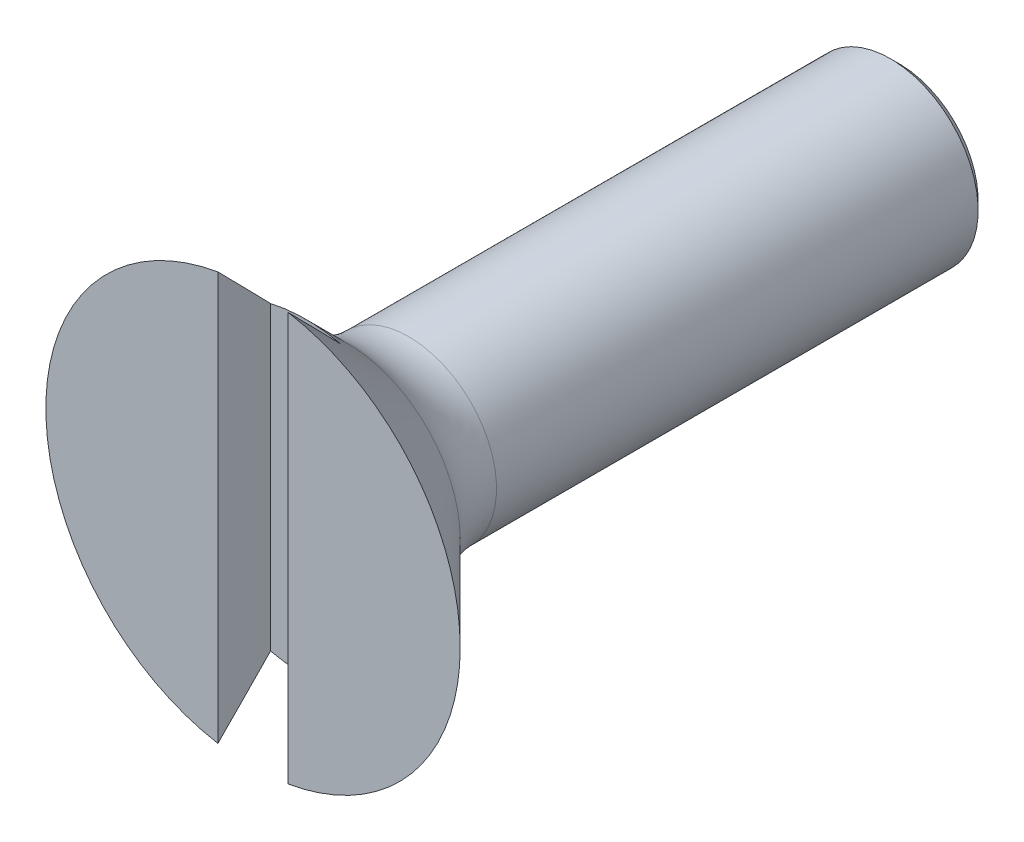
ISO-10303-21;
HEADER;
FILE_DESCRIPTION(('STEP AP214'),'2;1');
FILE_NAME('part.step','',(''),(''),'','','');
FILE_SCHEMA(('AUTOMOTIVE_DESIGN { 1 0 10303 214 1 1 1 1 }'));
ENDSEC;
DATA;
#1=APPLICATION_CONTEXT('core data for automotive mechanical design processes');
#2=APPLICATION_PROTOCOL_DEFINITION('international standard','automotive_design',2000,#1);
#3=PRODUCT_CONTEXT('',#1,'mechanical');
#4=PRODUCT('Part','Part','',(#3));
#5=PRODUCT_RELATED_PRODUCT_CATEGORY('part','',(#4));
#6=PRODUCT_DEFINITION_FORMATION('','',#4);
#7=PRODUCT_DEFINITION_CONTEXT('part definition',#1,'design');
#8=PRODUCT_DEFINITION('design','',#6,#7);
#9=PRODUCT_DEFINITION_SHAPE('','',#8);
#10=(LENGTH_UNIT() NAMED_UNIT(*) SI_UNIT(.MILLI.,.METRE.));
#11=(NAMED_UNIT(*) PLANE_ANGLE_UNIT() SI_UNIT($,.RADIAN.));
#12=(NAMED_UNIT(*) SI_UNIT($,.STERADIAN.) SOLID_ANGLE_UNIT());
#13=UNCERTAINTY_MEASURE_WITH_UNIT(LENGTH_MEASURE(1.E-05),#10,'distance_accuracy_value','');
#14=(GEOMETRIC_REPRESENTATION_CONTEXT(3) GLOBAL_UNCERTAINTY_ASSIGNED_CONTEXT((#13)) GLOBAL_UNIT_ASSIGNED_CONTEXT((#10,
#11,#12)) REPRESENTATION_CONTEXT('',''));
#15=CARTESIAN_POINT('',(0.,0.,0.));
#16=DIRECTION('',(0.,0.,1.));
#17=DIRECTION('',(1.,0.,0.));
#18=AXIS2_PLACEMENT_3D('',#15,#16,#17);
#19=CARTESIAN_POINT('',(0.,0.,-7.36000000000002));
#20=DIRECTION('',(0.,0.,-1.));
#21=DIRECTION('',(-1.,0.,0.));
#22=AXIS2_PLACEMENT_3D('',#19,#20,#21);
#23=PLANE('',#22);
#24=CARTESIAN_POINT('',(0.,0.,-7.36000000000002));
#25=DIRECTION('',(0.,0.,-1.));
#26=DIRECTION('',(-1.,0.,0.));
#27=AXIS2_PLACEMENT_3D('',#24,#25,#26);
#28=CIRCLE('',#27,0.900000000000001);
#29=CARTESIAN_POINT('',(-0.900000000000001,0.,-7.36000000000002));
#30=VERTEX_POINT('',#29);
#31=EDGE_CURVE('E294',#30,#30,#28,.T.);
#32=ORIENTED_EDGE('',*,*,#31,.T.);
#33=EDGE_LOOP('',(#32));
#34=FACE_BOUND('',#33,.T.);
#35=ADVANCED_FACE('F53',(#34),#23,.T.);
#36=CARTESIAN_POINT('',(0.,0.,-7.36000000000002));
#37=DIRECTION('',(0.,0.,1.));
#38=DIRECTION('',(1.,0.,0.));
#39=AXIS2_PLACEMENT_3D('',#36,#37,#38);
#40=CYLINDRICAL_SURFACE('',#39,1.);
#41=CARTESIAN_POINT('',(0.,0.,-1.7742135623731));
#42=DIRECTION('',(0.,0.,-1.));
#43=DIRECTION('',(-1.,0.,0.));
#44=AXIS2_PLACEMENT_3D('',#41,#42,#43);
#45=CIRCLE('',#44,1.);
#46=CARTESIAN_POINT('',(-1.,0.,-1.7742135623731));
#47=VERTEX_POINT('',#46);
#48=EDGE_CURVE('E61',#47,#47,#45,.T.);
#49=ORIENTED_EDGE('',*,*,#48,.T.);
#50=EDGE_LOOP('',(#49));
#51=FACE_BOUND('',#50,.T.);
#52=CARTESIAN_POINT('',(0.,0.,-7.26000000000002));
#53=DIRECTION('',(0.,0.,-1.));
#54=DIRECTION('',(-1.,0.,0.));
#55=AXIS2_PLACEMENT_3D('',#52,#53,#54);
#56=CIRCLE('',#55,1.);
#57=CARTESIAN_POINT('',(-1.,0.,-7.26000000000002));
#58=VERTEX_POINT('',#57);
#59=EDGE_CURVE('E291',#58,#58,#56,.F.);
#60=ORIENTED_EDGE('',*,*,#59,.T.);
#61=EDGE_LOOP('',(#60));
#62=FACE_BOUND('',#61,.T.);
#63=ADVANCED_FACE('F255',(#51,#62),#40,.T.);
#64=CARTESIAN_POINT('',(0.,0.,0.));
#65=DIRECTION('',(0.,0.,1.));
#66=DIRECTION('',(1.,0.,0.));
#67=AXIS2_PLACEMENT_3D('',#64,#65,#66);
#68=CONICAL_SURFACE('',#67,2.35999999999995,0.785398163397423);
#69=CARTESIAN_POINT('',(0.,0.,-1.06710678118657));
#70=DIRECTION('',(0.,0.,1.));
#71=DIRECTION('',(1.,0.,0.));
#72=AXIS2_PLACEMENT_3D('',#69,#70,#71);
#73=CIRCLE('',#72,1.29289321881343);
#74=CARTESIAN_POINT('',(1.29289321881343,0.,-1.06710678118657));
#75=VERTEX_POINT('',#74);
#76=EDGE_CURVE('E12',#75,#75,#73,.T.);
#77=ORIENTED_EDGE('',*,*,#76,.T.);
#78=EDGE_LOOP('',(#77));
#79=FACE_BOUND('',#78,.T.);
#80=CARTESIAN_POINT('',(0.,0.,0.));
#81=DIRECTION('',(0.,0.,-1.));
#82=DIRECTION('',(-1.,0.,0.));
#83=AXIS2_PLACEMENT_3D('',#80,#81,#82);
#84=CIRCLE('',#83,2.35999999999995);
#85=CARTESIAN_POINT('',(-0.4,-2.32585468161701,0.));
#86=VERTEX_POINT('',#85);
#87=CARTESIAN_POINT('',(-0.4,2.32585468161701,0.));
#88=VERTEX_POINT('',#87);
#89=EDGE_CURVE('E91',#86,#88,#84,.T.);
#90=ORIENTED_EDGE('',*,*,#89,.T.);
#91=CARTESIAN_POINT('',(-0.4,-2.32656495503559,0.000699999999999889));
#92=CARTESIAN_POINT('',(-0.4,-2.26204869474098,-0.0628803466088638));
#93=CARTESIAN_POINT('',(-0.4,-2.19749738240924,-0.126425179756412));
#94=CARTESIAN_POINT('',(-0.4,-2.06823771662149,-0.253471604549937));
#95=CARTESIAN_POINT('',(-0.4,-2.00352927403562,-0.316973105499626));
#96=CARTESIAN_POINT('',(-0.4,-1.87293299877024,-0.444875850474487));
#97=CARTESIAN_POINT('',(-0.4,-1.80704307581528,-0.509274962413416));
#98=CARTESIAN_POINT('',(-0.4,-1.67513964886887,-0.6378275419783));
#99=CARTESIAN_POINT('',(-0.4,-1.60912630921928,-0.701981178385814));
#100=CARTESIAN_POINT('',(-0.4,-1.44211200790205,-0.863662326419659));
#101=CARTESIAN_POINT('',(-0.4,-1.34094607076343,-0.961020262139882));
#102=CARTESIAN_POINT('',(-0.4,-1.18821169149702,-1.10636187815236));
#103=CARTESIAN_POINT('',(-0.4,-1.13705028410047,-1.15477293776482));
#104=CARTESIAN_POINT('',(-0.4,-1.03434418071918,-1.25114972470748));
#105=CARTESIAN_POINT('',(-0.4,-0.98279963442667,-1.29911561103009));
#106=CARTESIAN_POINT('',(-0.4,-0.879805739294339,-1.39374386881183));
#107=CARTESIAN_POINT('',(-0.4,-0.828364535018284,-1.44041509613475));
#108=CARTESIAN_POINT('',(-0.4,-0.724474224773309,-1.53278549718904));
#109=CARTESIAN_POINT('',(-0.4,-0.672023792361566,-1.57848319784407));
#110=CARTESIAN_POINT('',(-0.4,-0.592284170542029,-1.64543784500549));
#111=CARTESIAN_POINT('',(-0.4,-0.565610533931929,-1.66742560456166));
#112=CARTESIAN_POINT('',(-0.4,-0.511706641573272,-1.71070543880895));
#113=CARTESIAN_POINT('',(-0.4,-0.484476468396862,-1.73199761550154));
#114=CARTESIAN_POINT('',(-0.4,-0.429303555330142,-1.77350910235692));
#115=CARTESIAN_POINT('',(-0.4,-0.401362572327989,-1.79373073709806));
#116=CARTESIAN_POINT('',(-0.4,-0.344398644766111,-1.8325783585642));
#117=CARTESIAN_POINT('',(-0.4,-0.31537673884195,-1.85120582307801));
#118=CARTESIAN_POINT('',(-0.4,-0.278848423876699,-1.8724273849157));
#119=CARTESIAN_POINT('',(-0.4,-0.27206945076336,-1.87627526599331));
#120=CARTESIAN_POINT('',(-0.4,-0.258424452250879,-1.88381651937743));
#121=CARTESIAN_POINT('',(-0.4,-0.251558410366564,-1.88750986183756));
#122=CARTESIAN_POINT('',(-0.4,-0.230823116974631,-1.89832899324747));
#123=CARTESIAN_POINT('',(-0.4,-0.216815961464066,-1.90519431889811));
#124=CARTESIAN_POINT('',(-0.4,-0.188531711932087,-1.91797419371387));
#125=CARTESIAN_POINT('',(-0.4,-0.174258523491223,-1.92389727293941));
#126=CARTESIAN_POINT('',(-0.4,-0.145302499539535,-1.93463929404897));
#127=CARTESIAN_POINT('',(-0.4,-0.130619705052774,-1.93945834606456));
#128=CARTESIAN_POINT('',(-0.4,-0.0927072471791087,-1.94999022939773));
#129=CARTESIAN_POINT('',(-0.4,-0.0691949221225536,-1.95475049038998));
#130=CARTESIAN_POINT('',(-0.4,-0.021730232022874,-1.96009898653319));
#131=CARTESIAN_POINT('',(-0.4,0.00222098270157834,-1.96069689687055));
#132=CARTESIAN_POINT('',(-0.4,0.0497944197950578,-1.95761388184083));
#133=CARTESIAN_POINT('',(-0.4,0.0734170684727319,-1.95393915338486));
#134=CARTESIAN_POINT('',(-0.4,0.119863112603247,-1.94304371506574));
#135=CARTESIAN_POINT('',(-0.4,0.142683670951296,-1.93581155648805));
#136=CARTESIAN_POINT('',(-0.4,0.194206235173882,-1.9161720441261));
#137=CARTESIAN_POINT('',(-0.4,0.222550570714263,-1.90285642490799));
#138=CARTESIAN_POINT('',(-0.4,0.277838502213388,-1.87353919632578));
#139=CARTESIAN_POINT('',(-0.4,0.304778531340875,-1.85753114602185));
#140=CARTESIAN_POINT('',(-0.4,0.357797195524649,-1.823716433688));
#141=CARTESIAN_POINT('',(-0.4,0.383867052819692,-1.80589621416085));
#142=CARTESIAN_POINT('',(-0.4,0.435183595375668,-1.76918284674303));
#143=CARTESIAN_POINT('',(-0.4,0.460431208359118,-1.75029097900885));
#144=CARTESIAN_POINT('',(-0.4,0.513465918696997,-1.70936317614896));
#145=CARTESIAN_POINT('',(-0.4,0.541176802505307,-1.68722906484553));
#146=CARTESIAN_POINT('',(-0.4,0.596077744498629,-1.6423221210025));
#147=CARTESIAN_POINT('',(-0.4,0.62326774481819,-1.6195492181835));
#148=CARTESIAN_POINT('',(-0.4,0.704289475124071,-1.55054830877219));
#149=CARTESIAN_POINT('',(-0.4,0.757552455755487,-1.50365441103067));
#150=CARTESIAN_POINT('',(-0.4,0.863281898050423,-1.40883237009817));
#151=CARTESIAN_POINT('',(-0.4,0.915747067478544,-1.36090280201946));
#152=CARTESIAN_POINT('',(-0.4,1.02010867697272,-1.26445224891823));
#153=CARTESIAN_POINT('',(-0.4,1.07200524111559,-1.21593139800696));
#154=CARTESIAN_POINT('',(-0.4,1.17519213397316,-1.11871830870699));
#155=CARTESIAN_POINT('',(-0.4,1.22648414612191,-1.0700278521295));
#156=CARTESIAN_POINT('',(-0.4,1.32881190247131,-0.972372869400571));
#157=CARTESIAN_POINT('',(-0.4,1.37984763204618,-0.923408327937144));
#158=CARTESIAN_POINT('',(-0.4,1.53260719716622,-0.776294245570132));
#159=CARTESIAN_POINT('',(-0.4,1.63405403305121,-0.67785725133683));
#160=CARTESIAN_POINT('',(-0.4,1.78467375132089,-0.531081376146744));
#161=CARTESIAN_POINT('',(-0.4,1.83400722357799,-0.482906748022847));
#162=CARTESIAN_POINT('',(-0.4,1.93260023278796,-0.386465805762125));
#163=CARTESIAN_POINT('',(-0.4,1.98185975641074,-0.33819947798754));
#164=CARTESIAN_POINT('',(-0.4,2.08039480041792,-0.241521294095247));
#165=CARTESIAN_POINT('',(-0.4,2.12967021399292,-0.193109329177612));
#166=CARTESIAN_POINT('',(-0.4,2.22815912941686,-0.0962387339539683));
#167=CARTESIAN_POINT('',(-0.4,2.27737264015392,-0.0477801126852828));
#168=CARTESIAN_POINT('',(-0.4,2.32656495503559,0.000699999999999645));
#169=B_SPLINE_CURVE_WITH_KNOTS('',3,(#91,#92,#93,#94,#95,#96,#97,#98,#99,#100,#101,#102,#103,
#104,#105,#106,#107,#108,#109,#110,#111,#112,#113,#114,#115,#116,#117,#118,#119,#120,#121,#122,
#123,#124,#125,#126,#127,#128,#129,#130,#131,#132,#133,#134,#135,#136,#137,#138,#139,#140,#141,
#142,#143,#144,#145,#146,#147,#148,#149,#150,#151,#152,#153,#154,#155,#156,#157,#158,#159,#160,
#161,#162,#163,#164,#165,#166,#167,#168),.UNSPECIFIED.,.F.,.F.,(4,2,2,2,2,2,2,2,2,2,2,2,2,2,2,2,
2,2,2,2,2,2,2,2,2,2,2,2,2,2,2,2,2,2,2,2,2,2,4),(0.,0.271741221904306,0.54372754083414,
0.820130023967822,1.09628403244956,1.51748804339813,1.72879234874875,1.94001803437991,
2.14838635756828,2.35705030955321,2.4607470225224,2.5644284603406,2.66787465941964,
2.77122390147972,2.79460687073538,2.81799433534534,2.86476670525596,2.91108804280947,
2.95740475759198,3.02905210111757,3.1005328480209,3.17191005051494,3.24351848090941,
3.33721997238594,3.43114889436615,3.52584102293012,3.62042232464648,3.72680507506878,
3.83319957591221,4.04606707011853,4.25924887636116,4.47238319809998,4.68454862992936,
4.89672603527473,5.32078881913301,5.52764935960526,5.73454354455726,5.94177782470056,
6.14897784663137),.UNSPECIFIED.);
#170=CARTESIAN_POINT('',(-0.4,1.71394282285026,-0.6));
#171=VERTEX_POINT('',#170);
#172=EDGE_CURVE('E94',#171,#88,#169,.T.);
#173=ORIENTED_EDGE('',*,*,#172,.F.);
#174=CARTESIAN_POINT('',(0.,0.,-0.6));
#175=DIRECTION('',(0.,0.,-1.));
#176=DIRECTION('',(-1.,0.,0.));
#177=AXIS2_PLACEMENT_3D('',#174,#175,#176);
#178=CIRCLE('',#177,1.75999999999998);
#179=CARTESIAN_POINT('',(0.4,1.71394282285026,-0.6));
#180=VERTEX_POINT('',#179);
#181=EDGE_CURVE('E306',#180,#171,#178,.F.);
#182=ORIENTED_EDGE('',*,*,#181,.F.);
#183=CARTESIAN_POINT('',(0.4,2.32656495503559,0.000699999999999889));
#184=CARTESIAN_POINT('',(0.4,2.26204869474098,-0.0628803466088638));
#185=CARTESIAN_POINT('',(0.4,2.19749738240924,-0.126425179756412));
#186=CARTESIAN_POINT('',(0.4,2.06823771662149,-0.253471604549937));
#187=CARTESIAN_POINT('',(0.4,2.00352927403562,-0.316973105499626));
#188=CARTESIAN_POINT('',(0.4,1.87293299877024,-0.444875850474487));
#189=CARTESIAN_POINT('',(0.4,1.80704307581528,-0.509274962413416));
#190=CARTESIAN_POINT('',(0.4,1.67513964886887,-0.6378275419783));
#191=CARTESIAN_POINT('',(0.4,1.60912630921928,-0.701981178385814));
#192=CARTESIAN_POINT('',(0.4,1.44211200790205,-0.863662326419659));
#193=CARTESIAN_POINT('',(0.4,1.34094607076343,-0.961020262139882));
#194=CARTESIAN_POINT('',(0.4,1.18821169149702,-1.10636187815236));
#195=CARTESIAN_POINT('',(0.4,1.13705028410047,-1.15477293776482));
#196=CARTESIAN_POINT('',(0.4,1.03434418071918,-1.25114972470748));
#197=CARTESIAN_POINT('',(0.4,0.98279963442667,-1.29911561103009));
#198=CARTESIAN_POINT('',(0.4,0.879805739294339,-1.39374386881183));
#199=CARTESIAN_POINT('',(0.4,0.828364535018284,-1.44041509613475));
#200=CARTESIAN_POINT('',(0.4,0.724474224773309,-1.53278549718904));
#201=CARTESIAN_POINT('',(0.4,0.672023792361566,-1.57848319784407));
#202=CARTESIAN_POINT('',(0.4,0.592284170542029,-1.64543784500549));
#203=CARTESIAN_POINT('',(0.4,0.565610533931929,-1.66742560456166));
#204=CARTESIAN_POINT('',(0.4,0.511706641573272,-1.71070543880895));
#205=CARTESIAN_POINT('',(0.4,0.484476468396862,-1.73199761550154));
#206=CARTESIAN_POINT('',(0.4,0.429303555330142,-1.77350910235692));
#207=CARTESIAN_POINT('',(0.4,0.401362572327989,-1.79373073709806));
#208=CARTESIAN_POINT('',(0.4,0.344398644766111,-1.8325783585642));
#209=CARTESIAN_POINT('',(0.4,0.31537673884195,-1.85120582307801));
#210=CARTESIAN_POINT('',(0.4,0.278848423876699,-1.8724273849157));
#211=CARTESIAN_POINT('',(0.4,0.27206945076336,-1.87627526599331));
#212=CARTESIAN_POINT('',(0.4,0.258424452250879,-1.88381651937743));
#213=CARTESIAN_POINT('',(0.4,0.251558410366564,-1.88750986183756));
#214=CARTESIAN_POINT('',(0.4,0.230823116974631,-1.89832899324747));
#215=CARTESIAN_POINT('',(0.4,0.216815961464066,-1.90519431889811));
#216=CARTESIAN_POINT('',(0.4,0.188531711932087,-1.91797419371387));
#217=CARTESIAN_POINT('',(0.4,0.174258523491223,-1.92389727293941));
#218=CARTESIAN_POINT('',(0.4,0.145302499539535,-1.93463929404897));
#219=CARTESIAN_POINT('',(0.4,0.130619705052774,-1.93945834606456));
#220=CARTESIAN_POINT('',(0.4,0.0927072471791087,-1.94999022939773));
#221=CARTESIAN_POINT('',(0.4,0.0691949221225536,-1.95475049038998));
#222=CARTESIAN_POINT('',(0.4,0.021730232022874,-1.96009898653319));
#223=CARTESIAN_POINT('',(0.4,-0.00222098270157834,-1.96069689687055));
#224=CARTESIAN_POINT('',(0.4,-0.0497944197950578,-1.95761388184083));
#225=CARTESIAN_POINT('',(0.4,-0.0734170684727319,-1.95393915338486));
#226=CARTESIAN_POINT('',(0.4,-0.119863112603247,-1.94304371506574));
#227=CARTESIAN_POINT('',(0.4,-0.142683670951296,-1.93581155648805));
#228=CARTESIAN_POINT('',(0.4,-0.194206235173882,-1.9161720441261));
#229=CARTESIAN_POINT('',(0.4,-0.222550570714263,-1.90285642490799));
#230=CARTESIAN_POINT('',(0.4,-0.277838502213388,-1.87353919632578));
#231=CARTESIAN_POINT('',(0.4,-0.304778531340875,-1.85753114602185));
#232=CARTESIAN_POINT('',(0.4,-0.357797195524649,-1.823716433688));
#233=CARTESIAN_POINT('',(0.4,-0.383867052819692,-1.80589621416085));
#234=CARTESIAN_POINT('',(0.4,-0.435183595375668,-1.76918284674303));
#235=CARTESIAN_POINT('',(0.4,-0.460431208359118,-1.75029097900885));
#236=CARTESIAN_POINT('',(0.4,-0.513465918696997,-1.70936317614896));
#237=CARTESIAN_POINT('',(0.4,-0.541176802505307,-1.68722906484553));
#238=CARTESIAN_POINT('',(0.4,-0.596077744498629,-1.6423221210025));
#239=CARTESIAN_POINT('',(0.4,-0.62326774481819,-1.6195492181835));
#240=CARTESIAN_POINT('',(0.4,-0.704289475124071,-1.55054830877219));
#241=CARTESIAN_POINT('',(0.4,-0.757552455755487,-1.50365441103067));
#242=CARTESIAN_POINT('',(0.4,-0.863281898050423,-1.40883237009817));
#243=CARTESIAN_POINT('',(0.4,-0.915747067478544,-1.36090280201946));
#244=CARTESIAN_POINT('',(0.4,-1.02010867697272,-1.26445224891823));
#245=CARTESIAN_POINT('',(0.4,-1.07200524111559,-1.21593139800696));
#246=CARTESIAN_POINT('',(0.4,-1.17519213397316,-1.11871830870699));
#247=CARTESIAN_POINT('',(0.4,-1.22648414612191,-1.0700278521295));
#248=CARTESIAN_POINT('',(0.4,-1.32881190247131,-0.972372869400571));
#249=CARTESIAN_POINT('',(0.4,-1.37984763204618,-0.923408327937144));
#250=CARTESIAN_POINT('',(0.4,-1.53260719716622,-0.776294245570132));
#251=CARTESIAN_POINT('',(0.4,-1.63405403305121,-0.67785725133683));
#252=CARTESIAN_POINT('',(0.4,-1.78467375132089,-0.531081376146744));
#253=CARTESIAN_POINT('',(0.4,-1.83400722357799,-0.482906748022847));
#254=CARTESIAN_POINT('',(0.4,-1.93260023278796,-0.386465805762125));
#255=CARTESIAN_POINT('',(0.4,-1.98185975641074,-0.33819947798754));
#256=CARTESIAN_POINT('',(0.4,-2.08039480041792,-0.241521294095247));
#257=CARTESIAN_POINT('',(0.4,-2.12967021399292,-0.193109329177612));
#258=CARTESIAN_POINT('',(0.4,-2.22815912941686,-0.0962387339539683));
#259=CARTESIAN_POINT('',(0.4,-2.27737264015392,-0.0477801126852828));
#260=CARTESIAN_POINT('',(0.4,-2.32656495503559,0.000699999999999645));
#261=B_SPLINE_CURVE_WITH_KNOTS('',3,(#183,#184,#185,#186,#187,#188,#189,#190,#191,#192,#193,
#194,#195,#196,#197,#198,#199,#200,#201,#202,#203,#204,#205,#206,#207,#208,#209,#210,#211,#212,
#213,#214,#215,#216,#217,#218,#219,#220,#221,#222,#223,#224,#225,#226,#227,#228,#229,#230,#231,
#232,#233,#234,#235,#236,#237,#238,#239,#240,#241,#242,#243,#244,#245,#246,#247,#248,#249,#250,
#251,#252,#253,#254,#255,#256,#257,#258,#259,#260),.UNSPECIFIED.,.F.,.F.,(4,2,2,2,2,2,2,2,2,2,2,
2,2,2,2,2,2,2,2,2,2,2,2,2,2,2,2,2,2,2,2,2,2,2,2,2,2,2,4),(0.,0.271741221904306,0.54372754083414,
0.820130023967822,1.09628403244956,1.51748804339813,1.72879234874875,1.94001803437991,
2.14838635756828,2.35705030955321,2.4607470225224,2.5644284603406,2.66787465941964,
2.77122390147972,2.79460687073538,2.81799433534534,2.86476670525596,2.91108804280947,
2.95740475759198,3.02905210111757,3.1005328480209,3.17191005051494,3.24351848090941,
3.33721997238594,3.43114889436615,3.52584102293012,3.62042232464648,3.72680507506878,
3.83319957591221,4.04606707011853,4.25924887636116,4.47238319809998,4.68454862992936,
4.89672603527473,5.32078881913301,5.52764935960526,5.73454354455726,5.94177782470056,
6.14897784663137),.UNSPECIFIED.);
#262=CARTESIAN_POINT('',(0.4,2.32585468161701,0.));
#263=VERTEX_POINT('',#262);
#264=EDGE_CURVE('E68',#263,#180,#261,.T.);
#265=ORIENTED_EDGE('',*,*,#264,.F.);
#266=CARTESIAN_POINT('',(0.4,-2.32585468161701,0.));
#267=VERTEX_POINT('',#266);
#268=EDGE_CURVE('E101',#263,#267,#84,.T.);
#269=ORIENTED_EDGE('',*,*,#268,.T.);
#270=CARTESIAN_POINT('',(0.4,-1.71394282285026,-0.6));
#271=VERTEX_POINT('',#270);
#272=EDGE_CURVE('E74',#271,#267,#261,.T.);
#273=ORIENTED_EDGE('',*,*,#272,.F.);
#274=CARTESIAN_POINT('',(-0.4,-1.71394282285026,-0.6));
#275=VERTEX_POINT('',#274);
#276=EDGE_CURVE('E109',#275,#271,#178,.F.);
#277=ORIENTED_EDGE('',*,*,#276,.F.);
#278=EDGE_CURVE('E97',#86,#275,#169,.T.);
#279=ORIENTED_EDGE('',*,*,#278,.F.);
#280=EDGE_LOOP('',(#90,#173,#182,#265,#269,#273,#277,#279));
#281=FACE_BOUND('',#280,.T.);
#282=ADVANCED_FACE('F93',(#79,#281),#68,.T.);
#283=CARTESIAN_POINT('',(0.,0.,-0.6));
#284=DIRECTION('',(0.,0.,-1.));
#285=DIRECTION('',(0.,-1.,0.));
#286=AXIS2_PLACEMENT_3D('',#283,#284,#285);
#287=PLANE('',#286);
#288=DIRECTION('',(0.,-1.,0.));
#289=VECTOR('',#288,1.);
#290=CARTESIAN_POINT('',(-0.4,-10.,-0.6));
#291=LINE('',#290,#289);
#292=EDGE_CURVE('E108',#171,#275,#291,.T.);
#293=ORIENTED_EDGE('',*,*,#292,.T.);
#294=ORIENTED_EDGE('',*,*,#276,.T.);
#295=DIRECTION('',(0.,1.,0.));
#296=VECTOR('',#295,1.);
#297=CARTESIAN_POINT('',(0.4,-10.,-0.6));
#298=LINE('',#297,#296);
#299=EDGE_CURVE('E120',#271,#180,#298,.T.);
#300=ORIENTED_EDGE('',*,*,#299,.T.);
#301=ORIENTED_EDGE('',*,*,#181,.T.);
#302=EDGE_LOOP('',(#293,#294,#300,#301));
#303=FACE_BOUND('',#302,.T.);
#304=ADVANCED_FACE('F254',(#303),#287,.F.);
#305=CARTESIAN_POINT('',(0.,0.,0.));
#306=DIRECTION('',(0.,0.,-1.));
#307=DIRECTION('',(0.,-1.,0.));
#308=AXIS2_PLACEMENT_3D('',#305,#306,#307);
#309=PLANE('',#308);
#310=DIRECTION('',(0.,1.,0.));
#311=VECTOR('',#310,1.);
#312=CARTESIAN_POINT('',(-0.4,0.,0.));
#313=LINE('',#312,#311);
#314=EDGE_CURVE('E106',#86,#88,#313,.T.);
#315=ORIENTED_EDGE('',*,*,#314,.T.);
#316=ORIENTED_EDGE('',*,*,#89,.F.);
#317=EDGE_LOOP('',(#315,#316));
#318=FACE_BOUND('',#317,.T.);
#319=ADVANCED_FACE('F111',(#318),#309,.F.);
#320=CARTESIAN_POINT('',(0.,0.,0.));
#321=DIRECTION('',(0.,0.,-1.));
#322=DIRECTION('',(0.,-1.,0.));
#323=AXIS2_PLACEMENT_3D('',#320,#321,#322);
#324=PLANE('',#323);
#325=DIRECTION('',(0.,-1.,0.));
#326=VECTOR('',#325,1.);
#327=CARTESIAN_POINT('',(0.4,0.,0.));
#328=LINE('',#327,#326);
#329=EDGE_CURVE('E113',#263,#267,#328,.T.);
#330=ORIENTED_EDGE('',*,*,#329,.T.);
#331=ORIENTED_EDGE('',*,*,#268,.F.);
#332=EDGE_LOOP('',(#330,#331));
#333=FACE_BOUND('',#332,.T.);
#334=ADVANCED_FACE('F264',(#333),#324,.F.);
#335=CARTESIAN_POINT('',(-0.4,-10.,-0.6));
#336=DIRECTION('',(-1.,0.,0.));
#337=DIRECTION('',(0.,0.,1.));
#338=AXIS2_PLACEMENT_3D('',#335,#336,#337);
#339=PLANE('',#338);
#340=ORIENTED_EDGE('',*,*,#314,.F.);
#341=ORIENTED_EDGE('',*,*,#278,.T.);
#342=ORIENTED_EDGE('',*,*,#292,.F.);
#343=ORIENTED_EDGE('',*,*,#172,.T.);
#344=EDGE_LOOP('',(#340,#341,#342,#343));
#345=FACE_BOUND('',#344,.T.);
#346=ADVANCED_FACE('F105',(#345),#339,.F.);
#347=CARTESIAN_POINT('',(0.4,-10.,-0.6));
#348=DIRECTION('',(1.,0.,0.));
#349=DIRECTION('',(0.,1.,0.));
#350=AXIS2_PLACEMENT_3D('',#347,#348,#349);
#351=PLANE('',#350);
#352=ORIENTED_EDGE('',*,*,#329,.F.);
#353=ORIENTED_EDGE('',*,*,#264,.T.);
#354=ORIENTED_EDGE('',*,*,#299,.F.);
#355=ORIENTED_EDGE('',*,*,#272,.T.);
#356=EDGE_LOOP('',(#352,#353,#354,#355));
#357=FACE_BOUND('',#356,.T.);
#358=ADVANCED_FACE('F274',(#357),#351,.F.);
#359=CARTESIAN_POINT('',(0.,0.,-7.36000000000002));
#360=DIRECTION('',(0.,0.,1.));
#361=DIRECTION('',(1.,0.,0.));
#362=AXIS2_PLACEMENT_3D('',#359,#360,#361);
#363=CONICAL_SURFACE('',#362,0.900000000000001,0.785398163397448);
#364=ORIENTED_EDGE('',*,*,#59,.F.);
#365=EDGE_LOOP('',(#364));
#366=FACE_BOUND('',#365,.T.);
#367=ORIENTED_EDGE('',*,*,#31,.F.);
#368=EDGE_LOOP('',(#367));
#369=FACE_BOUND('',#368,.T.);
#370=ADVANCED_FACE('F277',(#366,#369),#363,.T.);
#371=CARTESIAN_POINT('',(0.,0.,-1.7742135623731));
#372=DIRECTION('',(0.,0.,-1.));
#373=DIRECTION('',(-1.,0.,0.));
#374=AXIS2_PLACEMENT_3D('',#371,#372,#373);
#375=TOROIDAL_SURFACE('',#374,2.,1.);
#376=ORIENTED_EDGE('',*,*,#76,.F.);
#377=EDGE_LOOP('',(#376));
#378=FACE_BOUND('',#377,.T.);
#379=ORIENTED_EDGE('',*,*,#48,.F.);
#380=EDGE_LOOP('',(#379));
#381=FACE_BOUND('',#380,.T.);
#382=ADVANCED_FACE('F55',(#378,#381),#375,.F.);
#383=CLOSED_SHELL('',(#35,#63,#282,#304,#319,#334,#346,#358,#370,#382));
#384=MANIFOLD_SOLID_BREP('B2',#383);
#385=ADVANCED_BREP_SHAPE_REPRESENTATION('',(#18,#384),#14);
#386=SHAPE_DEFINITION_REPRESENTATION(#9,#385);
ENDSEC;
END-ISO-10303-21;
